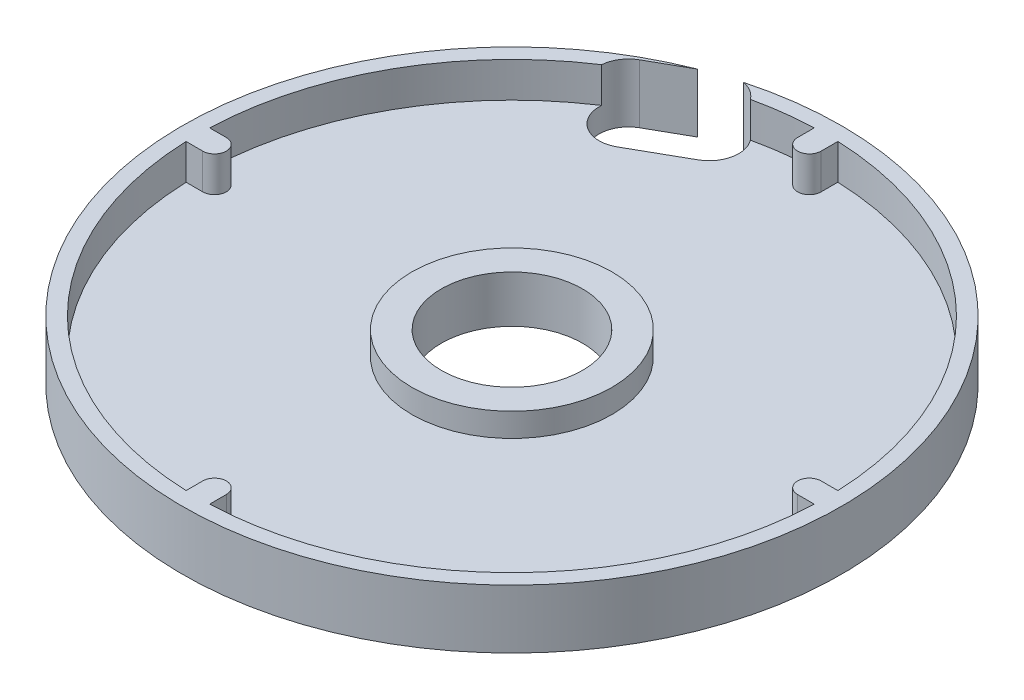
ISO-10303-21;
HEADER;
FILE_DESCRIPTION(('STEP AP214'),'2;1');
FILE_NAME('part.step','',(''),(''),'','','');
FILE_SCHEMA(('AUTOMOTIVE_DESIGN { 1 0 10303 214 1 1 1 1 }'));
ENDSEC;
DATA;
#1=APPLICATION_CONTEXT('core data for automotive mechanical design processes');
#2=APPLICATION_PROTOCOL_DEFINITION('international standard','automotive_design',2000,#1);
#3=PRODUCT_CONTEXT('',#1,'mechanical');
#4=PRODUCT('Part','Part','',(#3));
#5=PRODUCT_RELATED_PRODUCT_CATEGORY('part','',(#4));
#6=PRODUCT_DEFINITION_FORMATION('','',#4);
#7=PRODUCT_DEFINITION_CONTEXT('part definition',#1,'design');
#8=PRODUCT_DEFINITION('design','',#6,#7);
#9=PRODUCT_DEFINITION_SHAPE('','',#8);
#10=(LENGTH_UNIT() NAMED_UNIT(*) SI_UNIT(.MILLI.,.METRE.));
#11=(NAMED_UNIT(*) PLANE_ANGLE_UNIT() SI_UNIT($,.RADIAN.));
#12=(NAMED_UNIT(*) SI_UNIT($,.STERADIAN.) SOLID_ANGLE_UNIT());
#13=UNCERTAINTY_MEASURE_WITH_UNIT(LENGTH_MEASURE(1.E-05),#10,'distance_accuracy_value','');
#14=(GEOMETRIC_REPRESENTATION_CONTEXT(3) GLOBAL_UNCERTAINTY_ASSIGNED_CONTEXT((#13)) GLOBAL_UNIT_ASSIGNED_CONTEXT((#10,
#11,#12)) REPRESENTATION_CONTEXT('',''));
#15=CARTESIAN_POINT('',(0.,0.,0.));
#16=DIRECTION('',(0.,0.,1.));
#17=DIRECTION('',(1.,0.,0.));
#18=AXIS2_PLACEMENT_3D('',#15,#16,#17);
#19=CARTESIAN_POINT('',(0.,5.,0.));
#20=DIRECTION('',(0.,-1.,0.));
#21=DIRECTION('',(0.,0.,-1.));
#22=AXIS2_PLACEMENT_3D('',#19,#20,#21);
#23=CYLINDRICAL_SURFACE('',#22,26.7);
#24=DIRECTION('',(0.,1.,0.));
#25=VECTOR('',#24,1.);
#26=CARTESIAN_POINT('',(-14.679456215234,2.,-22.3025461601367));
#27=LINE('',#26,#25);
#28=CARTESIAN_POINT('',(-14.6794562152339,5.,-22.3025461601367));
#29=VERTEX_POINT('',#28);
#30=CARTESIAN_POINT('',(-14.679456215234,2.,-22.3025461601367));
#31=VERTEX_POINT('',#30);
#32=EDGE_CURVE('E244',#29,#31,#27,.F.);
#33=ORIENTED_EDGE('',*,*,#32,.F.);
#34=CARTESIAN_POINT('',(0.,5.,0.));
#35=DIRECTION('',(0.,1.,0.));
#36=DIRECTION('',(0.,0.,1.));
#37=AXIS2_PLACEMENT_3D('',#34,#35,#36);
#38=CIRCLE('',#37,26.7);
#39=CARTESIAN_POINT('',(-26.6812668364904,5.,-0.999999999999907));
#40=VERTEX_POINT('',#39);
#41=EDGE_CURVE('E400',#29,#40,#38,.T.);
#42=ORIENTED_EDGE('',*,*,#41,.T.);
#43=DIRECTION('',(0.,-1.,0.));
#44=VECTOR('',#43,1.);
#45=CARTESIAN_POINT('',(-26.6812668364904,5.,-0.999999999999907));
#46=LINE('',#45,#44);
#47=CARTESIAN_POINT('',(-26.6812668364904,2.,-0.999999999999907));
#48=VERTEX_POINT('',#47);
#49=EDGE_CURVE('E351',#40,#48,#46,.T.);
#50=ORIENTED_EDGE('',*,*,#49,.T.);
#51=CARTESIAN_POINT('',(0.,2.,0.));
#52=DIRECTION('',(0.,1.,0.));
#53=DIRECTION('',(0.,0.,1.));
#54=AXIS2_PLACEMENT_3D('',#51,#52,#53);
#55=CIRCLE('',#54,26.7);
#56=EDGE_CURVE('E415',#48,#31,#55,.F.);
#57=ORIENTED_EDGE('',*,*,#56,.T.);
#58=EDGE_LOOP('',(#33,#42,#50,#57));
#59=FACE_BOUND('',#58,.T.);
#60=ADVANCED_FACE('F49',(#59),#23,.F.);
#61=CARTESIAN_POINT('',(0.999999999999994,5.,26.6812668364904));
#62=VERTEX_POINT('',#61);
#63=CARTESIAN_POINT('',(26.6812668364904,5.,0.999999999999721));
#64=VERTEX_POINT('',#63);
#65=EDGE_CURVE('E436',#62,#64,#38,.T.);
#66=ORIENTED_EDGE('',*,*,#65,.T.);
#67=DIRECTION('',(0.,-1.,0.));
#68=VECTOR('',#67,1.);
#69=CARTESIAN_POINT('',(26.6812668364904,5.,0.999999999999721));
#70=LINE('',#69,#68);
#71=CARTESIAN_POINT('',(26.6812668364904,2.,0.999999999999721));
#72=VERTEX_POINT('',#71);
#73=EDGE_CURVE('E276',#64,#72,#70,.T.);
#74=ORIENTED_EDGE('',*,*,#73,.T.);
#75=CARTESIAN_POINT('',(1.,2.,26.6812668364904));
#76=VERTEX_POINT('',#75);
#77=EDGE_CURVE('E414',#72,#76,#55,.F.);
#78=ORIENTED_EDGE('',*,*,#77,.T.);
#79=DIRECTION('',(0.,-1.,0.));
#80=VECTOR('',#79,1.);
#81=CARTESIAN_POINT('',(0.999999999999994,5.,26.6812668364904));
#82=LINE('',#81,#80);
#83=EDGE_CURVE('E309',#62,#76,#82,.T.);
#84=ORIENTED_EDGE('',*,*,#83,.F.);
#85=EDGE_LOOP('',(#66,#74,#78,#84));
#86=FACE_BOUND('',#85,.T.);
#87=ADVANCED_FACE('F443',(#86),#23,.F.);
#88=CARTESIAN_POINT('',(1.,2.,-26.6812668364904));
#89=VERTEX_POINT('',#88);
#90=CARTESIAN_POINT('',(26.6812668364903,2.,-1.00000000000028));
#91=VERTEX_POINT('',#90);
#92=EDGE_CURVE('E409',#89,#91,#55,.F.);
#93=ORIENTED_EDGE('',*,*,#92,.T.);
#94=DIRECTION('',(0.,-1.,0.));
#95=VECTOR('',#94,1.);
#96=CARTESIAN_POINT('',(26.6812668364903,5.,-1.00000000000027));
#97=LINE('',#96,#95);
#98=CARTESIAN_POINT('',(26.6812668364903,5.,-1.00000000000027));
#99=VERTEX_POINT('',#98);
#100=EDGE_CURVE('E272',#99,#91,#97,.T.);
#101=ORIENTED_EDGE('',*,*,#100,.F.);
#102=CARTESIAN_POINT('',(1.,5.,-26.6812668364904));
#103=VERTEX_POINT('',#102);
#104=EDGE_CURVE('E394',#99,#103,#38,.T.);
#105=ORIENTED_EDGE('',*,*,#104,.T.);
#106=DIRECTION('',(0.,-1.,0.));
#107=VECTOR('',#106,1.);
#108=CARTESIAN_POINT('',(1.,5.,-26.6812668364904));
#109=LINE('',#108,#107);
#110=EDGE_CURVE('E387',#103,#89,#109,.T.);
#111=ORIENTED_EDGE('',*,*,#110,.T.);
#112=EDGE_LOOP('',(#93,#101,#105,#111));
#113=FACE_BOUND('',#112,.T.);
#114=ADVANCED_FACE('F458',(#113),#23,.F.);
#115=CARTESIAN_POINT('',(0.,2.,0.));
#116=DIRECTION('',(0.,1.,0.));
#117=DIRECTION('',(0.,0.,1.));
#118=AXIS2_PLACEMENT_3D('',#115,#116,#117);
#119=PLANE('',#118);
#120=CARTESIAN_POINT('',(0.,2.,0.));
#121=DIRECTION('',(0.,1.,0.));
#122=DIRECTION('',(0.,0.,1.));
#123=AXIS2_PLACEMENT_3D('',#120,#121,#122);
#124=CIRCLE('',#123,8.5);
#125=CARTESIAN_POINT('',(0.,2.,8.5));
#126=VERTEX_POINT('',#125);
#127=EDGE_CURVE('E544',#126,#126,#124,.T.);
#128=ORIENTED_EDGE('',*,*,#127,.F.);
#129=EDGE_LOOP('',(#128));
#130=FACE_BOUND('',#129,.T.);
#131=CARTESIAN_POINT('',(-12.1880900911582,2.,-22.0949532031084));
#132=DIRECTION('',(0.,1.,0.));
#133=DIRECTION('',(0.,0.,1.));
#134=AXIS2_PLACEMENT_3D('',#131,#132,#133);
#135=CIRCLE('',#134,2.5);
#136=CARTESIAN_POINT('',(-10.9579469494885,2.,-19.918546106308));
#137=VERTEX_POINT('',#136);
#138=EDGE_CURVE('E238',#31,#137,#135,.T.);
#139=ORIENTED_EDGE('',*,*,#138,.F.);
#140=ORIENTED_EDGE('',*,*,#56,.F.);
#141=DIRECTION('',(-1.,0.,0.));
#142=VECTOR('',#141,1.);
#143=CARTESIAN_POINT('',(-26.6812668364904,2.,-0.999999999999907));
#144=LINE('',#143,#142);
#145=CARTESIAN_POINT('',(-25.2627598229318,2.,-0.999999999999912));
#146=VERTEX_POINT('',#145);
#147=EDGE_CURVE('E337',#146,#48,#144,.T.);
#148=ORIENTED_EDGE('',*,*,#147,.F.);
#149=CARTESIAN_POINT('',(-25.2627598229318,2.,0.));
#150=DIRECTION('',(0.,1.,0.));
#151=DIRECTION('',(1.,0.,0.));
#152=AXIS2_PLACEMENT_3D('',#149,#150,#151);
#153=CIRCLE('',#152,1.);
#154=CARTESIAN_POINT('',(-25.2627598229318,2.,1.00000000000009));
#155=VERTEX_POINT('',#154);
#156=EDGE_CURVE('E320',#155,#146,#153,.T.);
#157=ORIENTED_EDGE('',*,*,#156,.F.);
#158=DIRECTION('',(1.,0.,0.));
#159=VECTOR('',#158,1.);
#160=CARTESIAN_POINT('',(-26.6812668364903,2.,1.00000000000009));
#161=LINE('',#160,#159);
#162=CARTESIAN_POINT('',(-26.6812668364903,2.,1.00000000000009));
#163=VERTEX_POINT('',#162);
#164=EDGE_CURVE('E326',#163,#155,#161,.T.);
#165=ORIENTED_EDGE('',*,*,#164,.F.);
#166=CARTESIAN_POINT('',(-1.,2.,26.6812668364904));
#167=VERTEX_POINT('',#166);
#168=EDGE_CURVE('E477',#167,#163,#55,.F.);
#169=ORIENTED_EDGE('',*,*,#168,.F.);
#170=DIRECTION('',(0.,0.,1.));
#171=VECTOR('',#170,1.);
#172=CARTESIAN_POINT('',(-1.,2.,26.6812668364904));
#173=LINE('',#172,#171);
#174=CARTESIAN_POINT('',(-1.,2.,25.2627598229318));
#175=VERTEX_POINT('',#174);
#176=EDGE_CURVE('E299',#175,#167,#173,.T.);
#177=ORIENTED_EDGE('',*,*,#176,.F.);
#178=CARTESIAN_POINT('',(0.,2.,25.2627598229318));
#179=DIRECTION('',(0.,1.,0.));
#180=DIRECTION('',(0.,0.,-1.));
#181=AXIS2_PLACEMENT_3D('',#178,#179,#180);
#182=CIRCLE('',#181,1.);
#183=CARTESIAN_POINT('',(1.,2.,25.2627598229318));
#184=VERTEX_POINT('',#183);
#185=EDGE_CURVE('E282',#184,#175,#182,.T.);
#186=ORIENTED_EDGE('',*,*,#185,.F.);
#187=DIRECTION('',(0.,0.,-1.));
#188=VECTOR('',#187,1.);
#189=CARTESIAN_POINT('',(1.,2.,26.6812668364904));
#190=LINE('',#189,#188);
#191=EDGE_CURVE('E288',#76,#184,#190,.T.);
#192=ORIENTED_EDGE('',*,*,#191,.F.);
#193=ORIENTED_EDGE('',*,*,#77,.F.);
#194=DIRECTION('',(1.,0.,0.));
#195=VECTOR('',#194,1.);
#196=CARTESIAN_POINT('',(26.6812668364904,2.,0.999999999999721));
#197=LINE('',#196,#195);
#198=CARTESIAN_POINT('',(25.2627598229318,2.,0.999999999999735));
#199=VERTEX_POINT('',#198);
#200=EDGE_CURVE('E73',#199,#72,#197,.T.);
#201=ORIENTED_EDGE('',*,*,#200,.F.);
#202=CARTESIAN_POINT('',(25.2627598229318,2.,-2.64613363468327E-13));
#203=DIRECTION('',(0.,1.,0.));
#204=DIRECTION('',(-1.,0.,0.));
#205=AXIS2_PLACEMENT_3D('',#202,#203,#204);
#206=CIRCLE('',#205,1.);
#207=CARTESIAN_POINT('',(25.2627598229318,2.,-1.00000000000026));
#208=VERTEX_POINT('',#207);
#209=EDGE_CURVE('E242',#208,#199,#206,.T.);
#210=ORIENTED_EDGE('',*,*,#209,.F.);
#211=DIRECTION('',(-1.,0.,0.));
#212=VECTOR('',#211,1.);
#213=CARTESIAN_POINT('',(26.6812668364903,2.,-1.00000000000028));
#214=LINE('',#213,#212);
#215=EDGE_CURVE('E253',#91,#208,#214,.T.);
#216=ORIENTED_EDGE('',*,*,#215,.F.);
#217=ORIENTED_EDGE('',*,*,#92,.F.);
#218=DIRECTION('',(0.,0.,-1.));
#219=VECTOR('',#218,1.);
#220=CARTESIAN_POINT('',(1.,2.,-26.6812668364904));
#221=LINE('',#220,#219);
#222=CARTESIAN_POINT('',(1.,2.,-25.2627598229318));
#223=VERTEX_POINT('',#222);
#224=EDGE_CURVE('E375',#223,#89,#221,.T.);
#225=ORIENTED_EDGE('',*,*,#224,.F.);
#226=CARTESIAN_POINT('',(0.,2.,-25.2627598229318));
#227=DIRECTION('',(0.,1.,0.));
#228=DIRECTION('',(0.,0.,1.));
#229=AXIS2_PLACEMENT_3D('',#226,#227,#228);
#230=CIRCLE('',#229,1.);
#231=CARTESIAN_POINT('',(-1.,2.,-25.2627598229318));
#232=VERTEX_POINT('',#231);
#233=EDGE_CURVE('E358',#232,#223,#230,.T.);
#234=ORIENTED_EDGE('',*,*,#233,.F.);
#235=DIRECTION('',(0.,0.,1.));
#236=VECTOR('',#235,1.);
#237=CARTESIAN_POINT('',(-1.,2.,-26.6812668364904));
#238=LINE('',#237,#236);
#239=CARTESIAN_POINT('',(-1.,2.,-26.6812668364904));
#240=VERTEX_POINT('',#239);
#241=EDGE_CURVE('E364',#240,#232,#238,.T.);
#242=ORIENTED_EDGE('',*,*,#241,.F.);
#243=CARTESIAN_POINT('',(-5.80635429602052,2.,-26.0610101452166));
#244=VERTEX_POINT('',#243);
#245=EDGE_CURVE('E408',#244,#240,#55,.F.);
#246=ORIENTED_EDGE('',*,*,#245,.F.);
#247=CARTESIAN_POINT('',(-7.81190990884179,2.,-24.568446349635));
#248=DIRECTION('',(0.,1.,0.));
#249=DIRECTION('',(0.,0.,1.));
#250=AXIS2_PLACEMENT_3D('',#247,#248,#249);
#251=CIRCLE('',#250,2.5);
#252=CARTESIAN_POINT('',(-6.58176676717204,2.,-22.3920392528347));
#253=VERTEX_POINT('',#252);
#254=EDGE_CURVE('E217',#253,#244,#251,.T.);
#255=ORIENTED_EDGE('',*,*,#254,.F.);
#256=DIRECTION('',(0.870562838720135,0.,-0.492057256667901));
#257=VECTOR('',#256,1.);
#258=CARTESIAN_POINT('',(-11.185584986031,2.,-19.7898811291318));
#259=LINE('',#258,#257);
#260=EDGE_CURVE('E224',#137,#253,#259,.T.);
#261=ORIENTED_EDGE('',*,*,#260,.F.);
#262=EDGE_LOOP('',(#139,#140,#148,#157,#165,#169,#177,#186,#192,#193,#201,#210,#216,#217,#225,
#234,#242,#246,#255,#261));
#263=FACE_BOUND('',#262,.T.);
#264=ADVANCED_FACE('F453',(#130,#263),#119,.T.);
#265=CARTESIAN_POINT('',(-26.6812668364904,5.,1.00000000000009));
#266=VERTEX_POINT('',#265);
#267=CARTESIAN_POINT('',(-1.,5.,26.6812668364904));
#268=VERTEX_POINT('',#267);
#269=EDGE_CURVE('E401',#266,#268,#38,.T.);
#270=ORIENTED_EDGE('',*,*,#269,.T.);
#271=DIRECTION('',(0.,-1.,0.));
#272=VECTOR('',#271,1.);
#273=CARTESIAN_POINT('',(-1.,5.,26.6812668364904));
#274=LINE('',#273,#272);
#275=EDGE_CURVE('E313',#268,#167,#274,.T.);
#276=ORIENTED_EDGE('',*,*,#275,.T.);
#277=ORIENTED_EDGE('',*,*,#168,.T.);
#278=DIRECTION('',(0.,-1.,0.));
#279=VECTOR('',#278,1.);
#280=CARTESIAN_POINT('',(-26.6812668364904,5.,1.00000000000009));
#281=LINE('',#280,#279);
#282=EDGE_CURVE('E347',#266,#163,#281,.T.);
#283=ORIENTED_EDGE('',*,*,#282,.F.);
#284=EDGE_LOOP('',(#270,#276,#277,#283));
#285=FACE_BOUND('',#284,.T.);
#286=ADVANCED_FACE('F485',(#285),#23,.F.);
#287=DIRECTION('',(0.,1.,0.));
#288=VECTOR('',#287,1.);
#289=CARTESIAN_POINT('',(-5.8063542960205,2.,-26.0610101452166));
#290=LINE('',#289,#288);
#291=CARTESIAN_POINT('',(-5.80635429602051,5.,-26.0610101452166));
#292=VERTEX_POINT('',#291);
#293=EDGE_CURVE('E65',#244,#292,#290,.T.);
#294=ORIENTED_EDGE('',*,*,#293,.F.);
#295=ORIENTED_EDGE('',*,*,#245,.T.);
#296=DIRECTION('',(0.,-1.,0.));
#297=VECTOR('',#296,1.);
#298=CARTESIAN_POINT('',(-0.999999999999994,5.,-26.6812668364904));
#299=LINE('',#298,#297);
#300=CARTESIAN_POINT('',(-0.999999999999994,5.,-26.6812668364904));
#301=VERTEX_POINT('',#300);
#302=EDGE_CURVE('E383',#301,#240,#299,.T.);
#303=ORIENTED_EDGE('',*,*,#302,.F.);
#304=EDGE_CURVE('E395',#301,#292,#38,.T.);
#305=ORIENTED_EDGE('',*,*,#304,.T.);
#306=EDGE_LOOP('',(#294,#295,#303,#305));
#307=FACE_BOUND('',#306,.T.);
#308=ADVANCED_FACE('F513',(#307),#23,.F.);
#309=CARTESIAN_POINT('',(0.,2.,0.));
#310=DIRECTION('',(0.,-1.,0.));
#311=DIRECTION('',(0.,0.,-1.));
#312=AXIS2_PLACEMENT_3D('',#309,#310,#311);
#313=CYLINDRICAL_SURFACE('',#312,28.);
#314=CARTESIAN_POINT('',(0.,5.,0.));
#315=DIRECTION('',(0.,1.,0.));
#316=DIRECTION('',(0.,0.,1.));
#317=AXIS2_PLACEMENT_3D('',#314,#315,#316);
#318=CIRCLE('',#317,28.);
#319=CARTESIAN_POINT('',(-10.2831472272416,5.,-26.043365433501));
#320=VERTEX_POINT('',#319);
#321=CARTESIAN_POINT('',(-7.33421817261031,5.,-27.0223841249538));
#322=VERTEX_POINT('',#321);
#323=EDGE_CURVE('E399',#320,#322,#318,.T.);
#324=ORIENTED_EDGE('',*,*,#323,.F.);
#325=DIRECTION('',(0.,-1.,0.));
#326=VECTOR('',#325,1.);
#327=CARTESIAN_POINT('',(-10.2831472272416,2.,-26.043365433501));
#328=LINE('',#327,#326);
#329=CARTESIAN_POINT('',(-10.2831472272416,0.,-26.043365433501));
#330=VERTEX_POINT('',#329);
#331=EDGE_CURVE('E216',#320,#330,#328,.T.);
#332=ORIENTED_EDGE('',*,*,#331,.T.);
#333=CARTESIAN_POINT('',(0.,0.,0.));
#334=DIRECTION('',(0.,1.,0.));
#335=DIRECTION('',(0.,0.,1.));
#336=AXIS2_PLACEMENT_3D('',#333,#334,#335);
#337=CIRCLE('',#336,28.);
#338=CARTESIAN_POINT('',(-7.33421817261034,0.,-27.0223841249537));
#339=VERTEX_POINT('',#338);
#340=EDGE_CURVE('E405',#330,#339,#337,.T.);
#341=ORIENTED_EDGE('',*,*,#340,.T.);
#342=DIRECTION('',(0.,1.,0.));
#343=VECTOR('',#342,1.);
#344=CARTESIAN_POINT('',(-7.33421817261032,2.,-27.0223841249537));
#345=LINE('',#344,#343);
#346=EDGE_CURVE('E211',#339,#322,#345,.T.);
#347=ORIENTED_EDGE('',*,*,#346,.T.);
#348=EDGE_LOOP('',(#324,#332,#341,#347));
#349=FACE_BOUND('',#348,.T.);
#350=ADVANCED_FACE('F51',(#349),#313,.T.);
#351=CARTESIAN_POINT('',(0.,0.,0.));
#352=DIRECTION('',(0.,1.,0.));
#353=DIRECTION('',(0.,0.,1.));
#354=AXIS2_PLACEMENT_3D('',#351,#352,#353);
#355=PLANE('',#354);
#356=CARTESIAN_POINT('',(0.,0.,0.));
#357=DIRECTION('',(0.,1.,0.));
#358=DIRECTION('',(0.,0.,1.));
#359=AXIS2_PLACEMENT_3D('',#356,#357,#358);
#360=CIRCLE('',#359,6.);
#361=CARTESIAN_POINT('',(0.,0.,6.));
#362=VERTEX_POINT('',#361);
#363=EDGE_CURVE('E559',#362,#362,#360,.T.);
#364=ORIENTED_EDGE('',*,*,#363,.T.);
#365=EDGE_LOOP('',(#364));
#366=FACE_BOUND('',#365,.T.);
#367=ORIENTED_EDGE('',*,*,#340,.F.);
#368=DIRECTION('',(-0.870562838720135,0.,0.4920572566679));
#369=VECTOR('',#368,1.);
#370=CARTESIAN_POINT('',(-13.6458712693705,0.,-24.1426953227325));
#371=LINE('',#370,#369);
#372=CARTESIAN_POINT('',(-13.418233232828,0.,-24.2713602999087));
#373=VERTEX_POINT('',#372);
#374=EDGE_CURVE('E233',#330,#373,#371,.T.);
#375=ORIENTED_EDGE('',*,*,#374,.T.);
#376=CARTESIAN_POINT('',(-12.1880900911582,0.,-22.0949532031084));
#377=DIRECTION('',(0.,1.,0.));
#378=DIRECTION('',(0.,0.,1.));
#379=AXIS2_PLACEMENT_3D('',#376,#377,#378);
#380=CIRCLE('',#379,2.5);
#381=CARTESIAN_POINT('',(-10.9579469494885,0.,-19.918546106308));
#382=VERTEX_POINT('',#381);
#383=EDGE_CURVE('E232',#373,#382,#380,.T.);
#384=ORIENTED_EDGE('',*,*,#383,.T.);
#385=DIRECTION('',(0.870562838720135,0.,-0.492057256667901));
#386=VECTOR('',#385,1.);
#387=CARTESIAN_POINT('',(-11.185584986031,0.,-19.7898811291318));
#388=LINE('',#387,#386);
#389=CARTESIAN_POINT('',(-6.58176676717204,0.,-22.3920392528347));
#390=VERTEX_POINT('',#389);
#391=EDGE_CURVE('E12',#382,#390,#388,.T.);
#392=ORIENTED_EDGE('',*,*,#391,.T.);
#393=CARTESIAN_POINT('',(-7.81190990884179,0.,-24.568446349635));
#394=DIRECTION('',(0.,1.,0.));
#395=DIRECTION('',(0.,0.,1.));
#396=AXIS2_PLACEMENT_3D('',#393,#394,#395);
#397=CIRCLE('',#396,2.5);
#398=EDGE_CURVE('E205',#390,#339,#397,.T.);
#399=ORIENTED_EDGE('',*,*,#398,.T.);
#400=EDGE_LOOP('',(#367,#375,#384,#392,#399));
#401=FACE_BOUND('',#400,.T.);
#402=ADVANCED_FACE('F230',(#366,#401),#355,.F.);
#403=CARTESIAN_POINT('',(0.,5.,0.));
#404=DIRECTION('',(0.,1.,0.));
#405=DIRECTION('',(0.,0.,1.));
#406=AXIS2_PLACEMENT_3D('',#403,#404,#405);
#407=PLANE('',#406);
#408=CARTESIAN_POINT('',(-12.1880900911582,5.,-22.0949532031084));
#409=DIRECTION('',(0.,1.,0.));
#410=DIRECTION('',(0.,0.,1.));
#411=AXIS2_PLACEMENT_3D('',#408,#409,#410);
#412=CIRCLE('',#411,2.5);
#413=CARTESIAN_POINT('',(-13.418233232828,5.,-24.2713602999087));
#414=VERTEX_POINT('',#413);
#415=EDGE_CURVE('E58',#414,#29,#412,.T.);
#416=ORIENTED_EDGE('',*,*,#415,.F.);
#417=DIRECTION('',(-0.870562838720135,0.,0.4920572566679));
#418=VECTOR('',#417,1.);
#419=CARTESIAN_POINT('',(-13.6458712693705,5.,-24.1426953227325));
#420=LINE('',#419,#418);
#421=EDGE_CURVE('E418',#320,#414,#420,.T.);
#422=ORIENTED_EDGE('',*,*,#421,.F.);
#423=ORIENTED_EDGE('',*,*,#323,.T.);
#424=CARTESIAN_POINT('',(-7.81190990884179,5.,-24.568446349635));
#425=DIRECTION('',(0.,1.,0.));
#426=DIRECTION('',(0.,0.,1.));
#427=AXIS2_PLACEMENT_3D('',#424,#425,#426);
#428=CIRCLE('',#427,2.5);
#429=EDGE_CURVE('E413',#292,#322,#428,.T.);
#430=ORIENTED_EDGE('',*,*,#429,.F.);
#431=ORIENTED_EDGE('',*,*,#304,.F.);
#432=DIRECTION('',(0.,0.,1.));
#433=VECTOR('',#432,1.);
#434=CARTESIAN_POINT('',(-1.,5.,-26.6812668364904));
#435=LINE('',#434,#433);
#436=CARTESIAN_POINT('',(-1.,5.,-25.2627598229318));
#437=VERTEX_POINT('',#436);
#438=EDGE_CURVE('E368',#301,#437,#435,.T.);
#439=ORIENTED_EDGE('',*,*,#438,.T.);
#440=CARTESIAN_POINT('',(0.,5.,-25.2627598229318));
#441=DIRECTION('',(0.,1.,0.));
#442=DIRECTION('',(0.,0.,1.));
#443=AXIS2_PLACEMENT_3D('',#440,#441,#442);
#444=CIRCLE('',#443,1.);
#445=CARTESIAN_POINT('',(1.,5.,-25.2627598229318));
#446=VERTEX_POINT('',#445);
#447=EDGE_CURVE('E359',#437,#446,#444,.T.);
#448=ORIENTED_EDGE('',*,*,#447,.T.);
#449=DIRECTION('',(0.,0.,-1.));
#450=VECTOR('',#449,1.);
#451=CARTESIAN_POINT('',(1.,5.,-26.6812668364904));
#452=LINE('',#451,#450);
#453=EDGE_CURVE('E363',#446,#103,#452,.T.);
#454=ORIENTED_EDGE('',*,*,#453,.T.);
#455=ORIENTED_EDGE('',*,*,#104,.F.);
#456=DIRECTION('',(-1.,0.,0.));
#457=VECTOR('',#456,1.);
#458=CARTESIAN_POINT('',(26.6812668364903,5.,-1.00000000000028));
#459=LINE('',#458,#457);
#460=CARTESIAN_POINT('',(25.2627598229318,5.,-1.00000000000026));
#461=VERTEX_POINT('',#460);
#462=EDGE_CURVE('E257',#99,#461,#459,.T.);
#463=ORIENTED_EDGE('',*,*,#462,.T.);
#464=CARTESIAN_POINT('',(25.2627598229318,5.,-2.64613363468327E-13));
#465=DIRECTION('',(0.,1.,0.));
#466=DIRECTION('',(-1.,0.,0.));
#467=AXIS2_PLACEMENT_3D('',#464,#465,#466);
#468=CIRCLE('',#467,1.);
#469=CARTESIAN_POINT('',(25.2627598229318,5.,0.999999999999736));
#470=VERTEX_POINT('',#469);
#471=EDGE_CURVE('E248',#461,#470,#468,.T.);
#472=ORIENTED_EDGE('',*,*,#471,.T.);
#473=DIRECTION('',(1.,0.,0.));
#474=VECTOR('',#473,1.);
#475=CARTESIAN_POINT('',(26.6812668364904,5.,0.999999999999721));
#476=LINE('',#475,#474);
#477=EDGE_CURVE('E252',#470,#64,#476,.T.);
#478=ORIENTED_EDGE('',*,*,#477,.T.);
#479=ORIENTED_EDGE('',*,*,#65,.F.);
#480=DIRECTION('',(0.,0.,-1.));
#481=VECTOR('',#480,1.);
#482=CARTESIAN_POINT('',(1.,5.,26.6812668364904));
#483=LINE('',#482,#481);
#484=CARTESIAN_POINT('',(1.,5.,25.2627598229318));
#485=VERTEX_POINT('',#484);
#486=EDGE_CURVE('E292',#62,#485,#483,.T.);
#487=ORIENTED_EDGE('',*,*,#486,.T.);
#488=CARTESIAN_POINT('',(0.,5.,25.2627598229318));
#489=DIRECTION('',(0.,1.,0.));
#490=DIRECTION('',(0.,0.,-1.));
#491=AXIS2_PLACEMENT_3D('',#488,#489,#490);
#492=CIRCLE('',#491,1.);
#493=CARTESIAN_POINT('',(-1.,5.,25.2627598229318));
#494=VERTEX_POINT('',#493);
#495=EDGE_CURVE('E283',#485,#494,#492,.T.);
#496=ORIENTED_EDGE('',*,*,#495,.T.);
#497=DIRECTION('',(0.,0.,1.));
#498=VECTOR('',#497,1.);
#499=CARTESIAN_POINT('',(-1.,5.,26.6812668364904));
#500=LINE('',#499,#498);
#501=EDGE_CURVE('E287',#494,#268,#500,.T.);
#502=ORIENTED_EDGE('',*,*,#501,.T.);
#503=ORIENTED_EDGE('',*,*,#269,.F.);
#504=DIRECTION('',(1.,0.,0.));
#505=VECTOR('',#504,1.);
#506=CARTESIAN_POINT('',(-26.6812668364903,5.,1.00000000000009));
#507=LINE('',#506,#505);
#508=CARTESIAN_POINT('',(-25.2627598229318,5.,1.00000000000009));
#509=VERTEX_POINT('',#508);
#510=EDGE_CURVE('E330',#266,#509,#507,.T.);
#511=ORIENTED_EDGE('',*,*,#510,.T.);
#512=CARTESIAN_POINT('',(-25.2627598229318,5.,0.));
#513=DIRECTION('',(0.,1.,0.));
#514=DIRECTION('',(1.,0.,0.));
#515=AXIS2_PLACEMENT_3D('',#512,#513,#514);
#516=CIRCLE('',#515,1.);
#517=CARTESIAN_POINT('',(-25.2627598229318,5.,-0.999999999999912));
#518=VERTEX_POINT('',#517);
#519=EDGE_CURVE('E321',#509,#518,#516,.T.);
#520=ORIENTED_EDGE('',*,*,#519,.T.);
#521=DIRECTION('',(-1.,0.,0.));
#522=VECTOR('',#521,1.);
#523=CARTESIAN_POINT('',(-26.6812668364904,5.,-0.999999999999907));
#524=LINE('',#523,#522);
#525=EDGE_CURVE('E325',#518,#40,#524,.T.);
#526=ORIENTED_EDGE('',*,*,#525,.T.);
#527=ORIENTED_EDGE('',*,*,#41,.F.);
#528=EDGE_LOOP('',(#416,#422,#423,#430,#431,#439,#448,#454,#455,#463,#472,#478,#479,#487,#496,
#502,#503,#511,#520,#526,#527));
#529=FACE_BOUND('',#528,.T.);
#530=ADVANCED_FACE('F432',(#529),#407,.T.);
#531=CARTESIAN_POINT('',(0.,5.,-25.2627598229318));
#532=DIRECTION('',(0.,-1.,0.));
#533=DIRECTION('',(0.,0.,-1.));
#534=AXIS2_PLACEMENT_3D('',#531,#532,#533);
#535=CYLINDRICAL_SURFACE('',#534,1.);
#536=ORIENTED_EDGE('',*,*,#233,.T.);
#537=DIRECTION('',(0.,-1.,0.));
#538=VECTOR('',#537,1.);
#539=CARTESIAN_POINT('',(1.,5.,-25.2627598229318));
#540=LINE('',#539,#538);
#541=EDGE_CURVE('E391',#446,#223,#540,.T.);
#542=ORIENTED_EDGE('',*,*,#541,.F.);
#543=ORIENTED_EDGE('',*,*,#447,.F.);
#544=DIRECTION('',(0.,-1.,0.));
#545=VECTOR('',#544,1.);
#546=CARTESIAN_POINT('',(-1.,5.,-25.2627598229318));
#547=LINE('',#546,#545);
#548=EDGE_CURVE('E371',#437,#232,#547,.T.);
#549=ORIENTED_EDGE('',*,*,#548,.T.);
#550=EDGE_LOOP('',(#536,#542,#543,#549));
#551=FACE_BOUND('',#550,.T.);
#552=ADVANCED_FACE('F468',(#551),#535,.T.);
#553=CARTESIAN_POINT('',(1.,5.,-26.6812668364904));
#554=DIRECTION('',(-1.,0.,0.));
#555=DIRECTION('',(0.,0.,1.));
#556=AXIS2_PLACEMENT_3D('',#553,#554,#555);
#557=PLANE('',#556);
#558=ORIENTED_EDGE('',*,*,#224,.T.);
#559=ORIENTED_EDGE('',*,*,#110,.F.);
#560=ORIENTED_EDGE('',*,*,#453,.F.);
#561=ORIENTED_EDGE('',*,*,#541,.T.);
#562=EDGE_LOOP('',(#558,#559,#560,#561));
#563=FACE_BOUND('',#562,.T.);
#564=ADVANCED_FACE('F464',(#563),#557,.F.);
#565=CARTESIAN_POINT('',(-1.,5.,-26.6812668364904));
#566=DIRECTION('',(1.,0.,0.));
#567=DIRECTION('',(0.,0.,-1.));
#568=AXIS2_PLACEMENT_3D('',#565,#566,#567);
#569=PLANE('',#568);
#570=ORIENTED_EDGE('',*,*,#241,.T.);
#571=ORIENTED_EDGE('',*,*,#548,.F.);
#572=ORIENTED_EDGE('',*,*,#438,.F.);
#573=ORIENTED_EDGE('',*,*,#302,.T.);
#574=EDGE_LOOP('',(#570,#571,#572,#573));
#575=FACE_BOUND('',#574,.T.);
#576=ADVANCED_FACE('F471',(#575),#569,.F.);
#577=CARTESIAN_POINT('',(-25.2627598229318,5.,0.));
#578=DIRECTION('',(0.,-1.,0.));
#579=DIRECTION('',(0.,0.,-1.));
#580=AXIS2_PLACEMENT_3D('',#577,#578,#579);
#581=CYLINDRICAL_SURFACE('',#580,1.);
#582=ORIENTED_EDGE('',*,*,#156,.T.);
#583=DIRECTION('',(0.,-1.,0.));
#584=VECTOR('',#583,1.);
#585=CARTESIAN_POINT('',(-25.2627598229318,5.,-0.999999999999912));
#586=LINE('',#585,#584);
#587=EDGE_CURVE('E354',#518,#146,#586,.T.);
#588=ORIENTED_EDGE('',*,*,#587,.F.);
#589=ORIENTED_EDGE('',*,*,#519,.F.);
#590=DIRECTION('',(0.,-1.,0.));
#591=VECTOR('',#590,1.);
#592=CARTESIAN_POINT('',(-25.2627598229318,5.,1.00000000000009));
#593=LINE('',#592,#591);
#594=EDGE_CURVE('E333',#509,#155,#593,.T.);
#595=ORIENTED_EDGE('',*,*,#594,.T.);
#596=EDGE_LOOP('',(#582,#588,#589,#595));
#597=FACE_BOUND('',#596,.T.);
#598=ADVANCED_FACE('F725',(#597),#581,.T.);
#599=CARTESIAN_POINT('',(-26.6812668364904,5.,-0.999999999999907));
#600=DIRECTION('',(0.,0.,1.));
#601=DIRECTION('',(1.,0.,0.));
#602=AXIS2_PLACEMENT_3D('',#599,#600,#601);
#603=PLANE('',#602);
#604=ORIENTED_EDGE('',*,*,#147,.T.);
#605=ORIENTED_EDGE('',*,*,#49,.F.);
#606=ORIENTED_EDGE('',*,*,#525,.F.);
#607=ORIENTED_EDGE('',*,*,#587,.T.);
#608=EDGE_LOOP('',(#604,#605,#606,#607));
#609=FACE_BOUND('',#608,.T.);
#610=ADVANCED_FACE('F509',(#609),#603,.F.);
#611=CARTESIAN_POINT('',(-26.6812668364903,5.,1.00000000000009));
#612=DIRECTION('',(0.,0.,-1.));
#613=DIRECTION('',(-1.,0.,0.));
#614=AXIS2_PLACEMENT_3D('',#611,#612,#613);
#615=PLANE('',#614);
#616=ORIENTED_EDGE('',*,*,#164,.T.);
#617=ORIENTED_EDGE('',*,*,#594,.F.);
#618=ORIENTED_EDGE('',*,*,#510,.F.);
#619=ORIENTED_EDGE('',*,*,#282,.T.);
#620=EDGE_LOOP('',(#616,#617,#618,#619));
#621=FACE_BOUND('',#620,.T.);
#622=ADVANCED_FACE('F490',(#621),#615,.F.);
#623=CARTESIAN_POINT('',(0.,5.,25.2627598229318));
#624=DIRECTION('',(0.,-1.,0.));
#625=DIRECTION('',(0.,0.,-1.));
#626=AXIS2_PLACEMENT_3D('',#623,#624,#625);
#627=CYLINDRICAL_SURFACE('',#626,1.);
#628=ORIENTED_EDGE('',*,*,#185,.T.);
#629=DIRECTION('',(0.,-1.,0.));
#630=VECTOR('',#629,1.);
#631=CARTESIAN_POINT('',(-1.,5.,25.2627598229318));
#632=LINE('',#631,#630);
#633=EDGE_CURVE('E316',#494,#175,#632,.T.);
#634=ORIENTED_EDGE('',*,*,#633,.F.);
#635=ORIENTED_EDGE('',*,*,#495,.F.);
#636=DIRECTION('',(0.,-1.,0.));
#637=VECTOR('',#636,1.);
#638=CARTESIAN_POINT('',(1.,5.,25.2627598229318));
#639=LINE('',#638,#637);
#640=EDGE_CURVE('E295',#485,#184,#639,.T.);
#641=ORIENTED_EDGE('',*,*,#640,.T.);
#642=EDGE_LOOP('',(#628,#634,#635,#641));
#643=FACE_BOUND('',#642,.T.);
#644=ADVANCED_FACE('F501',(#643),#627,.T.);
#645=CARTESIAN_POINT('',(-1.,5.,26.6812668364904));
#646=DIRECTION('',(1.,0.,0.));
#647=DIRECTION('',(0.,0.,-1.));
#648=AXIS2_PLACEMENT_3D('',#645,#646,#647);
#649=PLANE('',#648);
#650=ORIENTED_EDGE('',*,*,#176,.T.);
#651=ORIENTED_EDGE('',*,*,#275,.F.);
#652=ORIENTED_EDGE('',*,*,#501,.F.);
#653=ORIENTED_EDGE('',*,*,#633,.T.);
#654=EDGE_LOOP('',(#650,#651,#652,#653));
#655=FACE_BOUND('',#654,.T.);
#656=ADVANCED_FACE('F496',(#655),#649,.F.);
#657=CARTESIAN_POINT('',(1.,5.,26.6812668364904));
#658=DIRECTION('',(-1.,0.,0.));
#659=DIRECTION('',(0.,0.,1.));
#660=AXIS2_PLACEMENT_3D('',#657,#658,#659);
#661=PLANE('',#660);
#662=ORIENTED_EDGE('',*,*,#191,.T.);
#663=ORIENTED_EDGE('',*,*,#640,.F.);
#664=ORIENTED_EDGE('',*,*,#486,.F.);
#665=ORIENTED_EDGE('',*,*,#83,.T.);
#666=EDGE_LOOP('',(#662,#663,#664,#665));
#667=FACE_BOUND('',#666,.T.);
#668=ADVANCED_FACE('F500',(#667),#661,.F.);
#669=CARTESIAN_POINT('',(25.2627598229318,5.,-2.64613363468327E-13));
#670=DIRECTION('',(0.,-1.,0.));
#671=DIRECTION('',(0.,0.,-1.));
#672=AXIS2_PLACEMENT_3D('',#669,#670,#671);
#673=CYLINDRICAL_SURFACE('',#672,1.);
#674=ORIENTED_EDGE('',*,*,#209,.T.);
#675=DIRECTION('',(0.,-1.,0.));
#676=VECTOR('',#675,1.);
#677=CARTESIAN_POINT('',(25.2627598229318,5.,0.999999999999736));
#678=LINE('',#677,#676);
#679=EDGE_CURVE('E279',#470,#199,#678,.T.);
#680=ORIENTED_EDGE('',*,*,#679,.F.);
#681=ORIENTED_EDGE('',*,*,#471,.F.);
#682=DIRECTION('',(0.,-1.,0.));
#683=VECTOR('',#682,1.);
#684=CARTESIAN_POINT('',(25.2627598229318,5.,-1.00000000000026));
#685=LINE('',#684,#683);
#686=EDGE_CURVE('E260',#461,#208,#685,.T.);
#687=ORIENTED_EDGE('',*,*,#686,.T.);
#688=EDGE_LOOP('',(#674,#680,#681,#687));
#689=FACE_BOUND('',#688,.T.);
#690=ADVANCED_FACE('F451',(#689),#673,.T.);
#691=CARTESIAN_POINT('',(26.6812668364904,5.,0.999999999999721));
#692=DIRECTION('',(0.,0.,-1.));
#693=DIRECTION('',(-1.,0.,0.));
#694=AXIS2_PLACEMENT_3D('',#691,#692,#693);
#695=PLANE('',#694);
#696=ORIENTED_EDGE('',*,*,#200,.T.);
#697=ORIENTED_EDGE('',*,*,#73,.F.);
#698=ORIENTED_EDGE('',*,*,#477,.F.);
#699=ORIENTED_EDGE('',*,*,#679,.T.);
#700=EDGE_LOOP('',(#696,#697,#698,#699));
#701=FACE_BOUND('',#700,.T.);
#702=ADVANCED_FACE('F449',(#701),#695,.F.);
#703=CARTESIAN_POINT('',(26.6812668364903,5.,-1.00000000000028));
#704=DIRECTION('',(0.,0.,1.));
#705=DIRECTION('',(1.,0.,0.));
#706=AXIS2_PLACEMENT_3D('',#703,#704,#705);
#707=PLANE('',#706);
#708=ORIENTED_EDGE('',*,*,#215,.T.);
#709=ORIENTED_EDGE('',*,*,#686,.F.);
#710=ORIENTED_EDGE('',*,*,#462,.F.);
#711=ORIENTED_EDGE('',*,*,#100,.T.);
#712=EDGE_LOOP('',(#708,#709,#710,#711));
#713=FACE_BOUND('',#712,.T.);
#714=ADVANCED_FACE('F456',(#713),#707,.F.);
#715=CARTESIAN_POINT('',(-10.9579469494885,-3.,-19.918546106308));
#716=DIRECTION('',(0.492057256667901,0.,0.870562838720135));
#717=DIRECTION('',(0.870562838720135,0.,-0.492057256667901));
#718=AXIS2_PLACEMENT_3D('',#715,#716,#717);
#719=PLANE('',#718);
#720=ORIENTED_EDGE('',*,*,#260,.T.);
#721=DIRECTION('',(0.,1.,0.));
#722=VECTOR('',#721,1.);
#723=CARTESIAN_POINT('',(-6.58176676717204,-3.,-22.3920392528347));
#724=LINE('',#723,#722);
#725=EDGE_CURVE('E208',#390,#253,#724,.T.);
#726=ORIENTED_EDGE('',*,*,#725,.F.);
#727=ORIENTED_EDGE('',*,*,#391,.F.);
#728=DIRECTION('',(0.,1.,0.));
#729=VECTOR('',#728,1.);
#730=CARTESIAN_POINT('',(-10.9579469494885,-3.,-19.918546106308));
#731=LINE('',#730,#729);
#732=EDGE_CURVE('E227',#382,#137,#731,.T.);
#733=ORIENTED_EDGE('',*,*,#732,.T.);
#734=EDGE_LOOP('',(#720,#726,#727,#733));
#735=FACE_BOUND('',#734,.T.);
#736=ADVANCED_FACE('F220',(#735),#719,.F.);
#737=CARTESIAN_POINT('',(-12.1880900911582,-3.,-22.0949532031084));
#738=DIRECTION('',(0.,1.,0.));
#739=DIRECTION('',(0.,0.,1.));
#740=AXIS2_PLACEMENT_3D('',#737,#738,#739);
#741=CYLINDRICAL_SURFACE('',#740,2.5);
#742=DIRECTION('',(0.,1.,0.));
#743=VECTOR('',#742,1.);
#744=CARTESIAN_POINT('',(-13.418233232828,-3.,-24.2713602999087));
#745=LINE('',#744,#743);
#746=EDGE_CURVE('E226',#373,#414,#745,.T.);
#747=ORIENTED_EDGE('',*,*,#746,.T.);
#748=ORIENTED_EDGE('',*,*,#415,.T.);
#749=ORIENTED_EDGE('',*,*,#32,.T.);
#750=ORIENTED_EDGE('',*,*,#138,.T.);
#751=ORIENTED_EDGE('',*,*,#732,.F.);
#752=ORIENTED_EDGE('',*,*,#383,.F.);
#753=EDGE_LOOP('',(#747,#748,#749,#750,#751,#752));
#754=FACE_BOUND('',#753,.T.);
#755=ADVANCED_FACE('F423',(#754),#741,.F.);
#756=CARTESIAN_POINT('',(-13.418233232828,-3.,-24.2713602999087));
#757=DIRECTION('',(-0.4920572566679,0.,-0.870562838720135));
#758=DIRECTION('',(-0.870562838720135,0.,0.4920572566679));
#759=AXIS2_PLACEMENT_3D('',#756,#757,#758);
#760=PLANE('',#759);
#761=ORIENTED_EDGE('',*,*,#331,.F.);
#762=ORIENTED_EDGE('',*,*,#421,.T.);
#763=ORIENTED_EDGE('',*,*,#746,.F.);
#764=ORIENTED_EDGE('',*,*,#374,.F.);
#765=EDGE_LOOP('',(#761,#762,#763,#764));
#766=FACE_BOUND('',#765,.T.);
#767=ADVANCED_FACE('F540',(#766),#760,.F.);
#768=CARTESIAN_POINT('',(-7.81190990884179,-3.,-24.568446349635));
#769=DIRECTION('',(0.,1.,0.));
#770=DIRECTION('',(0.,0.,1.));
#771=AXIS2_PLACEMENT_3D('',#768,#769,#770);
#772=CYLINDRICAL_SURFACE('',#771,2.5);
#773=ORIENTED_EDGE('',*,*,#725,.T.);
#774=ORIENTED_EDGE('',*,*,#254,.T.);
#775=ORIENTED_EDGE('',*,*,#293,.T.);
#776=ORIENTED_EDGE('',*,*,#429,.T.);
#777=ORIENTED_EDGE('',*,*,#346,.F.);
#778=ORIENTED_EDGE('',*,*,#398,.F.);
#779=EDGE_LOOP('',(#773,#774,#775,#776,#777,#778));
#780=FACE_BOUND('',#779,.T.);
#781=ADVANCED_FACE('F207',(#780),#772,.F.);
#782=CARTESIAN_POINT('',(0.,4.,0.));
#783=DIRECTION('',(0.,1.,0.));
#784=DIRECTION('',(0.,0.,1.));
#785=AXIS2_PLACEMENT_3D('',#782,#783,#784);
#786=PLANE('',#785);
#787=CARTESIAN_POINT('',(0.,4.,0.));
#788=DIRECTION('',(0.,1.,0.));
#789=DIRECTION('',(0.,0.,1.));
#790=AXIS2_PLACEMENT_3D('',#787,#788,#789);
#791=CIRCLE('',#790,8.5);
#792=CARTESIAN_POINT('',(0.,4.,8.5));
#793=VERTEX_POINT('',#792);
#794=EDGE_CURVE('E547',#793,#793,#791,.T.);
#795=ORIENTED_EDGE('',*,*,#794,.T.);
#796=EDGE_LOOP('',(#795));
#797=FACE_BOUND('',#796,.T.);
#798=CARTESIAN_POINT('',(0.,4.,0.));
#799=DIRECTION('',(0.,1.,0.));
#800=DIRECTION('',(0.,0.,1.));
#801=AXIS2_PLACEMENT_3D('',#798,#799,#800);
#802=CIRCLE('',#801,6.);
#803=CARTESIAN_POINT('',(0.,4.,6.));
#804=VERTEX_POINT('',#803);
#805=EDGE_CURVE('E554',#804,#804,#802,.T.);
#806=ORIENTED_EDGE('',*,*,#805,.F.);
#807=EDGE_LOOP('',(#806));
#808=FACE_BOUND('',#807,.T.);
#809=ADVANCED_FACE('F573',(#797,#808),#786,.T.);
#810=CARTESIAN_POINT('',(0.,4.,0.));
#811=DIRECTION('',(0.,-1.,0.));
#812=DIRECTION('',(0.,0.,-1.));
#813=AXIS2_PLACEMENT_3D('',#810,#811,#812);
#814=CYLINDRICAL_SURFACE('',#813,8.5);
#815=ORIENTED_EDGE('',*,*,#794,.F.);
#816=EDGE_LOOP('',(#815));
#817=FACE_BOUND('',#816,.T.);
#818=ORIENTED_EDGE('',*,*,#127,.T.);
#819=EDGE_LOOP('',(#818));
#820=FACE_BOUND('',#819,.T.);
#821=ADVANCED_FACE('F567',(#817,#820),#814,.T.);
#822=CARTESIAN_POINT('',(0.,4.,0.));
#823=DIRECTION('',(0.,-1.,0.));
#824=DIRECTION('',(0.,0.,-1.));
#825=AXIS2_PLACEMENT_3D('',#822,#823,#824);
#826=CYLINDRICAL_SURFACE('',#825,6.);
#827=ORIENTED_EDGE('',*,*,#805,.T.);
#828=EDGE_LOOP('',(#827));
#829=FACE_BOUND('',#828,.T.);
#830=ORIENTED_EDGE('',*,*,#363,.F.);
#831=EDGE_LOOP('',(#830));
#832=FACE_BOUND('',#831,.T.);
#833=ADVANCED_FACE('F565',(#829,#832),#826,.F.);
#834=CLOSED_SHELL('',(#60,#87,#114,#264,#286,#308,#350,#402,#530,#552,#564,#576,#598,#610,#622,
#644,#656,#668,#690,#702,#714,#736,#755,#767,#781,#809,#821,#833));
#835=MANIFOLD_SOLID_BREP('B2',#834);
#836=ADVANCED_BREP_SHAPE_REPRESENTATION('',(#18,#835),#14);
#837=SHAPE_DEFINITION_REPRESENTATION(#9,#836);
ENDSEC;
END-ISO-10303-21;
